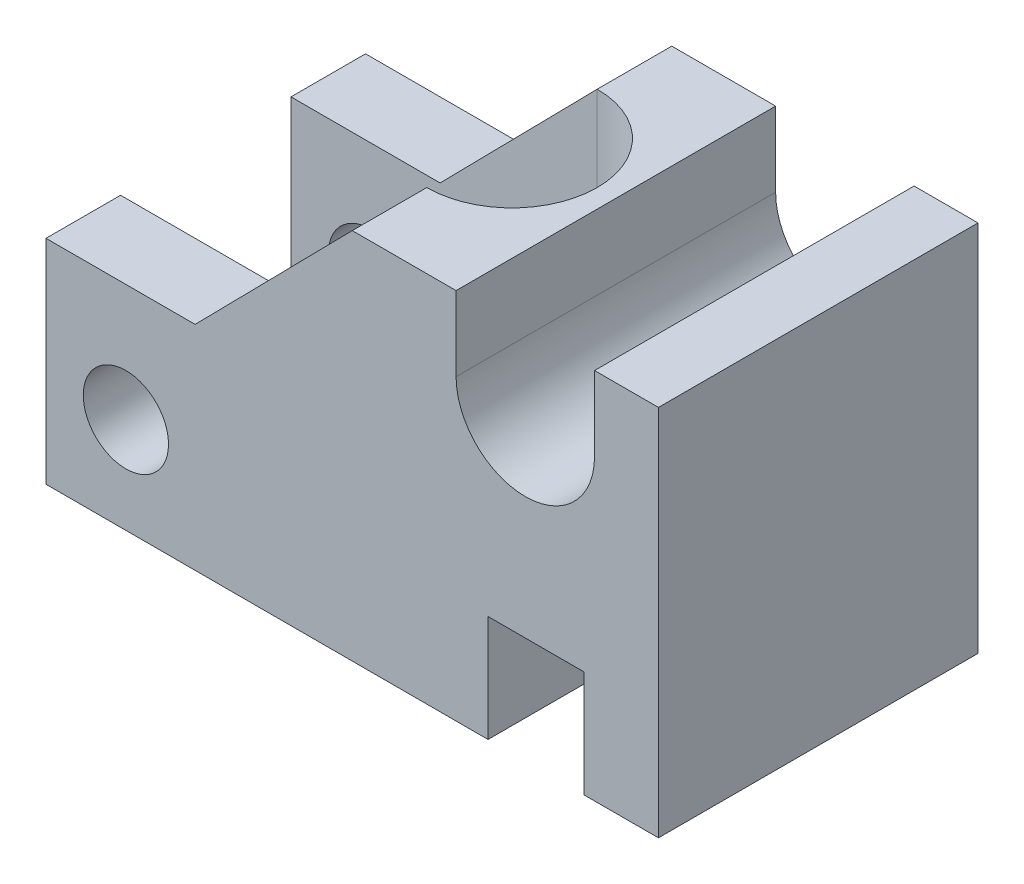
ISO-10303-21;
HEADER;
FILE_DESCRIPTION(('STEP AP214'),'2;1');
FILE_NAME('part.step','',(''),(''),'','','');
FILE_SCHEMA(('AUTOMOTIVE_DESIGN { 1 0 10303 214 1 1 1 1 }'));
ENDSEC;
DATA;
#1=APPLICATION_CONTEXT('core data for automotive mechanical design processes');
#2=APPLICATION_PROTOCOL_DEFINITION('international standard','automotive_design',2000,#1);
#3=PRODUCT_CONTEXT('',#1,'mechanical');
#4=PRODUCT('Part','Part','',(#3));
#5=PRODUCT_RELATED_PRODUCT_CATEGORY('part','',(#4));
#6=PRODUCT_DEFINITION_FORMATION('','',#4);
#7=PRODUCT_DEFINITION_CONTEXT('part definition',#1,'design');
#8=PRODUCT_DEFINITION('design','',#6,#7);
#9=PRODUCT_DEFINITION_SHAPE('','',#8);
#10=(LENGTH_UNIT() NAMED_UNIT(*) SI_UNIT(.MILLI.,.METRE.));
#11=(NAMED_UNIT(*) PLANE_ANGLE_UNIT() SI_UNIT($,.RADIAN.));
#12=(NAMED_UNIT(*) SI_UNIT($,.STERADIAN.) SOLID_ANGLE_UNIT());
#13=UNCERTAINTY_MEASURE_WITH_UNIT(LENGTH_MEASURE(1.E-05),#10,'distance_accuracy_value','');
#14=(GEOMETRIC_REPRESENTATION_CONTEXT(3) GLOBAL_UNCERTAINTY_ASSIGNED_CONTEXT((#13)) GLOBAL_UNIT_ASSIGNED_CONTEXT((#10,
#11,#12)) REPRESENTATION_CONTEXT('',''));
#15=CARTESIAN_POINT('',(0.,0.,0.));
#16=DIRECTION('',(0.,0.,1.));
#17=DIRECTION('',(1.,0.,0.));
#18=AXIS2_PLACEMENT_3D('',#15,#16,#17);
#19=CARTESIAN_POINT('',(-28.4029319771153,27.9295497774967,60.));
#20=DIRECTION('',(0.713023679810584,-0.701139951813741,0.));
#21=DIRECTION('',(0.701139951813741,0.713023679810584,0.));
#22=AXIS2_PLACEMENT_3D('',#19,#20,#21);
#23=PLANE('',#22);
#24=DIRECTION('',(0.,0.,-1.));
#25=VECTOR('',#24,1.);
#26=CARTESIAN_POINT('',(12.9663440750129,70.,60.));
#27=LINE('',#26,#25);
#28=CARTESIAN_POINT('',(12.9663440750129,70.,60.));
#29=VERTEX_POINT('',#28);
#30=CARTESIAN_POINT('',(12.966344075013,70.,46.));
#31=VERTEX_POINT('',#30);
#32=EDGE_CURVE('E290',#29,#31,#27,.T.);
#33=ORIENTED_EDGE('',*,*,#32,.T.);
#34=DIRECTION('',(-0.701139951813741,-0.713023679810584,0.));
#35=VECTOR('',#34,1.);
#36=CARTESIAN_POINT('',(-28.4029319771153,27.9295497774967,46.));
#37=LINE('',#36,#35);
#38=CARTESIAN_POINT('',(-16.5336559249871,40.,46.));
#39=VERTEX_POINT('',#38);
#40=EDGE_CURVE('E204',#31,#39,#37,.T.);
#41=ORIENTED_EDGE('',*,*,#40,.T.);
#42=DIRECTION('',(0.,0.,-1.));
#43=VECTOR('',#42,1.);
#44=CARTESIAN_POINT('',(-16.5336559249871,40.,60.));
#45=LINE('',#44,#43);
#46=CARTESIAN_POINT('',(-16.5336559249871,40.,60.));
#47=VERTEX_POINT('',#46);
#48=EDGE_CURVE('E285',#47,#39,#45,.T.);
#49=ORIENTED_EDGE('',*,*,#48,.F.);
#50=DIRECTION('',(-0.701139951813741,-0.713023679810584,0.));
#51=VECTOR('',#50,1.);
#52=CARTESIAN_POINT('',(-28.4029319771153,27.9295497774967,60.));
#53=LINE('',#52,#51);
#54=EDGE_CURVE('E349',#29,#47,#53,.T.);
#55=ORIENTED_EDGE('',*,*,#54,.F.);
#56=EDGE_LOOP('',(#33,#41,#49,#55));
#57=FACE_BOUND('',#56,.T.);
#58=ADVANCED_FACE('F47',(#57),#23,.F.);
#59=CARTESIAN_POINT('',(0.,40.,60.));
#60=DIRECTION('',(0.,-1.,0.));
#61=DIRECTION('',(1.,0.,0.));
#62=AXIS2_PLACEMENT_3D('',#59,#60,#61);
#63=PLANE('',#62);
#64=ORIENTED_EDGE('',*,*,#48,.T.);
#65=DIRECTION('',(-1.,0.,0.));
#66=VECTOR('',#65,1.);
#67=CARTESIAN_POINT('',(0.,40.,46.));
#68=LINE('',#67,#66);
#69=CARTESIAN_POINT('',(-44.5336559249871,40.,46.));
#70=VERTEX_POINT('',#69);
#71=EDGE_CURVE('E333',#39,#70,#68,.T.);
#72=ORIENTED_EDGE('',*,*,#71,.T.);
#73=DIRECTION('',(0.,0.,-1.));
#74=VECTOR('',#73,1.);
#75=CARTESIAN_POINT('',(-44.5336559249871,40.,60.));
#76=LINE('',#75,#74);
#77=CARTESIAN_POINT('',(-44.5336559249871,40.,60.));
#78=VERTEX_POINT('',#77);
#79=EDGE_CURVE('E280',#78,#70,#76,.T.);
#80=ORIENTED_EDGE('',*,*,#79,.F.);
#81=DIRECTION('',(-1.,0.,0.));
#82=VECTOR('',#81,1.);
#83=CARTESIAN_POINT('',(0.,40.,60.));
#84=LINE('',#83,#82);
#85=EDGE_CURVE('E352',#47,#78,#84,.T.);
#86=ORIENTED_EDGE('',*,*,#85,.F.);
#87=EDGE_LOOP('',(#64,#72,#80,#86));
#88=FACE_BOUND('',#87,.T.);
#89=ADVANCED_FACE('F398',(#88),#63,.F.);
#90=CARTESIAN_POINT('',(-44.5336559249871,0.,60.));
#91=DIRECTION('',(1.,0.,0.));
#92=DIRECTION('',(0.,0.,-1.));
#93=AXIS2_PLACEMENT_3D('',#90,#91,#92);
#94=PLANE('',#93);
#95=ORIENTED_EDGE('',*,*,#79,.T.);
#96=DIRECTION('',(0.,-1.,0.));
#97=VECTOR('',#96,1.);
#98=CARTESIAN_POINT('',(-44.5336559249871,0.,46.));
#99=LINE('',#98,#97);
#100=CARTESIAN_POINT('',(-44.5336559249871,-1.63899307903939E-13,46.));
#101=VERTEX_POINT('',#100);
#102=EDGE_CURVE('E329',#70,#101,#99,.T.);
#103=ORIENTED_EDGE('',*,*,#102,.T.);
#104=DIRECTION('',(0.,0.,-1.));
#105=VECTOR('',#104,1.);
#106=CARTESIAN_POINT('',(-44.5336559249871,0.,60.));
#107=LINE('',#106,#105);
#108=CARTESIAN_POINT('',(-44.5336559249871,0.,60.));
#109=VERTEX_POINT('',#108);
#110=EDGE_CURVE('E275',#109,#101,#107,.T.);
#111=ORIENTED_EDGE('',*,*,#110,.F.);
#112=DIRECTION('',(0.,-1.,0.));
#113=VECTOR('',#112,1.);
#114=CARTESIAN_POINT('',(-44.5336559249871,0.,60.));
#115=LINE('',#114,#113);
#116=EDGE_CURVE('E355',#78,#109,#115,.T.);
#117=ORIENTED_EDGE('',*,*,#116,.F.);
#118=EDGE_LOOP('',(#95,#103,#111,#117));
#119=FACE_BOUND('',#118,.T.);
#120=ADVANCED_FACE('F380',(#119),#94,.F.);
#121=CARTESIAN_POINT('',(-29.5336559249871,18.,60.));
#122=DIRECTION('',(0.,0.,-1.));
#123=DIRECTION('',(-1.,0.,0.));
#124=AXIS2_PLACEMENT_3D('',#121,#122,#123);
#125=CYLINDRICAL_SURFACE('',#124,8.);
#126=CARTESIAN_POINT('',(-29.5336559249871,18.,46.));
#127=DIRECTION('',(0.,0.,1.));
#128=DIRECTION('',(1.,0.,0.));
#129=AXIS2_PLACEMENT_3D('',#126,#127,#128);
#130=CIRCLE('',#129,8.);
#131=CARTESIAN_POINT('',(-21.5336559249871,18.,46.));
#132=VERTEX_POINT('',#131);
#133=EDGE_CURVE('E51',#132,#132,#130,.T.);
#134=ORIENTED_EDGE('',*,*,#133,.F.);
#135=EDGE_LOOP('',(#134));
#136=FACE_BOUND('',#135,.T.);
#137=CARTESIAN_POINT('',(-29.5336559249871,18.,60.));
#138=DIRECTION('',(0.,0.,1.));
#139=DIRECTION('',(1.,0.,0.));
#140=AXIS2_PLACEMENT_3D('',#137,#138,#139);
#141=CIRCLE('',#140,8.);
#142=CARTESIAN_POINT('',(-21.5336559249871,18.,60.));
#143=VERTEX_POINT('',#142);
#144=EDGE_CURVE('E192',#143,#143,#141,.T.);
#145=ORIENTED_EDGE('',*,*,#144,.T.);
#146=EDGE_LOOP('',(#145));
#147=FACE_BOUND('',#146,.T.);
#148=ADVANCED_FACE('F377',(#136,#147),#125,.F.);
#149=CARTESIAN_POINT('',(45.4663440750129,56.,60.));
#150=DIRECTION('',(0.,0.,-1.));
#151=DIRECTION('',(-1.,0.,0.));
#152=AXIS2_PLACEMENT_3D('',#149,#150,#151);
#153=CYLINDRICAL_SURFACE('',#152,13.);
#154=CARTESIAN_POINT('',(45.4663440750129,56.,0.));
#155=DIRECTION('',(0.,0.,1.));
#156=DIRECTION('',(1.,0.,0.));
#157=AXIS2_PLACEMENT_3D('',#154,#155,#156);
#158=CIRCLE('',#157,13.);
#159=CARTESIAN_POINT('',(32.4663440750129,56.,0.));
#160=VERTEX_POINT('',#159);
#161=CARTESIAN_POINT('',(58.4663440750129,56.,0.));
#162=VERTEX_POINT('',#161);
#163=EDGE_CURVE('E199',#160,#162,#158,.T.);
#164=ORIENTED_EDGE('',*,*,#163,.F.);
#165=DIRECTION('',(0.,0.,-1.));
#166=VECTOR('',#165,1.);
#167=CARTESIAN_POINT('',(32.4663440750129,56.,60.));
#168=LINE('',#167,#166);
#169=CARTESIAN_POINT('',(32.4663440750129,56.,60.));
#170=VERTEX_POINT('',#169);
#171=EDGE_CURVE('E11',#170,#160,#168,.T.);
#172=ORIENTED_EDGE('',*,*,#171,.F.);
#173=CARTESIAN_POINT('',(45.4663440750129,56.,60.));
#174=DIRECTION('',(0.,0.,1.));
#175=DIRECTION('',(1.,0.,0.));
#176=AXIS2_PLACEMENT_3D('',#173,#174,#175);
#177=CIRCLE('',#176,13.);
#178=CARTESIAN_POINT('',(58.4663440750129,56.,60.));
#179=VERTEX_POINT('',#178);
#180=EDGE_CURVE('E251',#170,#179,#177,.T.);
#181=ORIENTED_EDGE('',*,*,#180,.T.);
#182=DIRECTION('',(0.,0.,-1.));
#183=VECTOR('',#182,1.);
#184=CARTESIAN_POINT('',(58.4663440750129,56.,60.));
#185=LINE('',#184,#183);
#186=EDGE_CURVE('E124',#179,#162,#185,.T.);
#187=ORIENTED_EDGE('',*,*,#186,.T.);
#188=EDGE_LOOP('',(#164,#172,#181,#187));
#189=FACE_BOUND('',#188,.T.);
#190=ADVANCED_FACE('F49',(#189),#153,.F.);
#191=CARTESIAN_POINT('',(32.4663440750129,0.,60.));
#192=DIRECTION('',(1.,0.,0.));
#193=DIRECTION('',(0.,1.,0.));
#194=AXIS2_PLACEMENT_3D('',#191,#192,#193);
#195=PLANE('',#194);
#196=DIRECTION('',(0.,-1.,0.));
#197=VECTOR('',#196,1.);
#198=CARTESIAN_POINT('',(32.4663440750129,0.,0.));
#199=LINE('',#198,#197);
#200=CARTESIAN_POINT('',(32.4663440750129,70.,0.));
#201=VERTEX_POINT('',#200);
#202=EDGE_CURVE('E203',#201,#160,#199,.T.);
#203=ORIENTED_EDGE('',*,*,#202,.F.);
#204=DIRECTION('',(0.,0.,-1.));
#205=VECTOR('',#204,1.);
#206=CARTESIAN_POINT('',(32.4663440750129,70.,60.));
#207=LINE('',#206,#205);
#208=CARTESIAN_POINT('',(32.4663440750129,70.,60.));
#209=VERTEX_POINT('',#208);
#210=EDGE_CURVE('E57',#209,#201,#207,.T.);
#211=ORIENTED_EDGE('',*,*,#210,.F.);
#212=DIRECTION('',(0.,-1.,0.));
#213=VECTOR('',#212,1.);
#214=CARTESIAN_POINT('',(32.4663440750129,0.,60.));
#215=LINE('',#214,#213);
#216=EDGE_CURVE('E342',#209,#170,#215,.T.);
#217=ORIENTED_EDGE('',*,*,#216,.T.);
#218=ORIENTED_EDGE('',*,*,#171,.T.);
#219=EDGE_LOOP('',(#203,#211,#217,#218));
#220=FACE_BOUND('',#219,.T.);
#221=ADVANCED_FACE('F418',(#220),#195,.T.);
#222=CARTESIAN_POINT('',(0.,70.,60.));
#223=DIRECTION('',(0.,-1.,0.));
#224=DIRECTION('',(0.,0.,-1.));
#225=AXIS2_PLACEMENT_3D('',#222,#223,#224);
#226=PLANE('',#225);
#227=CARTESIAN_POINT('',(12.966344075013,70.,14.));
#228=VERTEX_POINT('',#227);
#229=CARTESIAN_POINT('',(12.9663440750129,70.,0.));
#230=VERTEX_POINT('',#229);
#231=EDGE_CURVE('E289',#228,#230,#27,.T.);
#232=ORIENTED_EDGE('',*,*,#231,.F.);
#233=CARTESIAN_POINT('',(12.966344075013,70.,30.));
#234=DIRECTION('',(0.,1.,0.));
#235=DIRECTION('',(-1.,0.,0.));
#236=AXIS2_PLACEMENT_3D('',#233,#234,#235);
#237=CIRCLE('',#236,16.);
#238=EDGE_CURVE('E319',#31,#228,#237,.T.);
#239=ORIENTED_EDGE('',*,*,#238,.F.);
#240=ORIENTED_EDGE('',*,*,#32,.F.);
#241=DIRECTION('',(-1.,0.,0.));
#242=VECTOR('',#241,1.);
#243=CARTESIAN_POINT('',(0.,70.,60.));
#244=LINE('',#243,#242);
#245=EDGE_CURVE('E346',#209,#29,#244,.T.);
#246=ORIENTED_EDGE('',*,*,#245,.F.);
#247=ORIENTED_EDGE('',*,*,#210,.T.);
#248=DIRECTION('',(-1.,0.,0.));
#249=VECTOR('',#248,1.);
#250=CARTESIAN_POINT('',(0.,70.,0.));
#251=LINE('',#250,#249);
#252=EDGE_CURVE('E208',#201,#230,#251,.T.);
#253=ORIENTED_EDGE('',*,*,#252,.T.);
#254=EDGE_LOOP('',(#232,#239,#240,#246,#247,#253));
#255=FACE_BOUND('',#254,.T.);
#256=ADVANCED_FACE('F410',(#255),#226,.F.);
#257=CARTESIAN_POINT('',(-16.5336559249871,40.,14.));
#258=VERTEX_POINT('',#257);
#259=CARTESIAN_POINT('',(-16.5336559249871,40.,0.));
#260=VERTEX_POINT('',#259);
#261=EDGE_CURVE('E284',#258,#260,#45,.T.);
#262=ORIENTED_EDGE('',*,*,#261,.F.);
#263=DIRECTION('',(0.701139951813741,0.713023679810584,0.));
#264=VECTOR('',#263,1.);
#265=CARTESIAN_POINT('',(-28.4029319771153,27.9295497774967,14.));
#266=LINE('',#265,#264);
#267=EDGE_CURVE('E325',#258,#228,#266,.T.);
#268=ORIENTED_EDGE('',*,*,#267,.T.);
#269=ORIENTED_EDGE('',*,*,#231,.T.);
#270=DIRECTION('',(-0.701139951813741,-0.713023679810584,0.));
#271=VECTOR('',#270,1.);
#272=CARTESIAN_POINT('',(-28.4029319771153,27.9295497774967,0.));
#273=LINE('',#272,#271);
#274=EDGE_CURVE('E212',#230,#260,#273,.T.);
#275=ORIENTED_EDGE('',*,*,#274,.T.);
#276=EDGE_LOOP('',(#262,#268,#269,#275));
#277=FACE_BOUND('',#276,.T.);
#278=ADVANCED_FACE('F401',(#277),#23,.F.);
#279=CARTESIAN_POINT('',(-44.5336559249871,40.,14.));
#280=VERTEX_POINT('',#279);
#281=CARTESIAN_POINT('',(-44.5336559249871,40.,0.));
#282=VERTEX_POINT('',#281);
#283=EDGE_CURVE('E279',#280,#282,#76,.T.);
#284=ORIENTED_EDGE('',*,*,#283,.F.);
#285=DIRECTION('',(1.,0.,0.));
#286=VECTOR('',#285,1.);
#287=CARTESIAN_POINT('',(0.,40.,14.));
#288=LINE('',#287,#286);
#289=EDGE_CURVE('E303',#280,#258,#288,.T.);
#290=ORIENTED_EDGE('',*,*,#289,.T.);
#291=ORIENTED_EDGE('',*,*,#261,.T.);
#292=DIRECTION('',(-1.,0.,0.));
#293=VECTOR('',#292,1.);
#294=CARTESIAN_POINT('',(0.,40.,0.));
#295=LINE('',#294,#293);
#296=EDGE_CURVE('E216',#260,#282,#295,.T.);
#297=ORIENTED_EDGE('',*,*,#296,.T.);
#298=EDGE_LOOP('',(#284,#290,#291,#297));
#299=FACE_BOUND('',#298,.T.);
#300=ADVANCED_FACE('F407',(#299),#63,.F.);
#301=CARTESIAN_POINT('',(-44.5336559249871,0.,14.));
#302=VERTEX_POINT('',#301);
#303=CARTESIAN_POINT('',(-44.5336559249871,0.,0.));
#304=VERTEX_POINT('',#303);
#305=EDGE_CURVE('E274',#302,#304,#107,.T.);
#306=ORIENTED_EDGE('',*,*,#305,.F.);
#307=DIRECTION('',(0.,1.,0.));
#308=VECTOR('',#307,1.);
#309=CARTESIAN_POINT('',(-44.5336559249871,0.,14.));
#310=LINE('',#309,#308);
#311=EDGE_CURVE('E65',#302,#280,#310,.T.);
#312=ORIENTED_EDGE('',*,*,#311,.T.);
#313=ORIENTED_EDGE('',*,*,#283,.T.);
#314=DIRECTION('',(0.,-1.,0.));
#315=VECTOR('',#314,1.);
#316=CARTESIAN_POINT('',(-44.5336559249871,0.,0.));
#317=LINE('',#316,#315);
#318=EDGE_CURVE('E220',#282,#304,#317,.T.);
#319=ORIENTED_EDGE('',*,*,#318,.T.);
#320=EDGE_LOOP('',(#306,#312,#313,#319));
#321=FACE_BOUND('',#320,.T.);
#322=ADVANCED_FACE('F416',(#321),#94,.F.);
#323=CARTESIAN_POINT('',(0.,0.,60.));
#324=DIRECTION('',(0.,1.,0.));
#325=DIRECTION('',(0.,0.,1.));
#326=AXIS2_PLACEMENT_3D('',#323,#324,#325);
#327=PLANE('',#326);
#328=ORIENTED_EDGE('',*,*,#110,.T.);
#329=DIRECTION('',(1.,0.,0.));
#330=VECTOR('',#329,1.);
#331=CARTESIAN_POINT('',(12.9663440750131,0.,46.));
#332=LINE('',#331,#330);
#333=CARTESIAN_POINT('',(12.9663440750131,0.,46.));
#334=VERTEX_POINT('',#333);
#335=EDGE_CURVE('E316',#101,#334,#332,.T.);
#336=ORIENTED_EDGE('',*,*,#335,.T.);
#337=CARTESIAN_POINT('',(12.9663440750131,0.,30.));
#338=DIRECTION('',(0.,1.,0.));
#339=DIRECTION('',(-1.,0.,0.));
#340=AXIS2_PLACEMENT_3D('',#337,#338,#339);
#341=CIRCLE('',#340,16.);
#342=CARTESIAN_POINT('',(12.9663440750131,0.,14.));
#343=VERTEX_POINT('',#342);
#344=EDGE_CURVE('E491',#334,#343,#341,.T.);
#345=ORIENTED_EDGE('',*,*,#344,.T.);
#346=DIRECTION('',(-1.,0.,0.));
#347=VECTOR('',#346,1.);
#348=CARTESIAN_POINT('',(12.9663440750131,0.,14.));
#349=LINE('',#348,#347);
#350=EDGE_CURVE('E440',#343,#302,#349,.T.);
#351=ORIENTED_EDGE('',*,*,#350,.T.);
#352=ORIENTED_EDGE('',*,*,#305,.T.);
#353=DIRECTION('',(1.,0.,0.));
#354=VECTOR('',#353,1.);
#355=CARTESIAN_POINT('',(0.,0.,0.));
#356=LINE('',#355,#354);
#357=CARTESIAN_POINT('',(38.4663440750129,0.,0.));
#358=VERTEX_POINT('',#357);
#359=EDGE_CURVE('E224',#304,#358,#356,.T.);
#360=ORIENTED_EDGE('',*,*,#359,.T.);
#361=DIRECTION('',(0.,0.,-1.));
#362=VECTOR('',#361,1.);
#363=CARTESIAN_POINT('',(38.4663440750129,0.,60.));
#364=LINE('',#363,#362);
#365=CARTESIAN_POINT('',(38.4663440750129,0.,60.));
#366=VERTEX_POINT('',#365);
#367=EDGE_CURVE('E270',#366,#358,#364,.T.);
#368=ORIENTED_EDGE('',*,*,#367,.F.);
#369=DIRECTION('',(1.,0.,0.));
#370=VECTOR('',#369,1.);
#371=CARTESIAN_POINT('',(0.,0.,60.));
#372=LINE('',#371,#370);
#373=EDGE_CURVE('E358',#109,#366,#372,.T.);
#374=ORIENTED_EDGE('',*,*,#373,.F.);
#375=EDGE_LOOP('',(#328,#336,#345,#351,#352,#360,#368,#374));
#376=FACE_BOUND('',#375,.T.);
#377=ADVANCED_FACE('F436',(#376),#327,.F.);
#378=CARTESIAN_POINT('',(38.4663440750129,0.,60.));
#379=DIRECTION('',(-1.,0.,0.));
#380=DIRECTION('',(0.,0.,1.));
#381=AXIS2_PLACEMENT_3D('',#378,#379,#380);
#382=PLANE('',#381);
#383=DIRECTION('',(0.,1.,0.));
#384=VECTOR('',#383,1.);
#385=CARTESIAN_POINT('',(38.4663440750129,0.,0.));
#386=LINE('',#385,#384);
#387=CARTESIAN_POINT('',(38.4663440750129,20.,0.));
#388=VERTEX_POINT('',#387);
#389=EDGE_CURVE('E227',#358,#388,#386,.T.);
#390=ORIENTED_EDGE('',*,*,#389,.T.);
#391=DIRECTION('',(0.,0.,-1.));
#392=VECTOR('',#391,1.);
#393=CARTESIAN_POINT('',(38.4663440750129,20.,60.));
#394=LINE('',#393,#392);
#395=CARTESIAN_POINT('',(38.4663440750129,20.,60.));
#396=VERTEX_POINT('',#395);
#397=EDGE_CURVE('E266',#396,#388,#394,.T.);
#398=ORIENTED_EDGE('',*,*,#397,.F.);
#399=DIRECTION('',(0.,1.,0.));
#400=VECTOR('',#399,1.);
#401=CARTESIAN_POINT('',(38.4663440750129,0.,60.));
#402=LINE('',#401,#400);
#403=EDGE_CURVE('E361',#366,#396,#402,.T.);
#404=ORIENTED_EDGE('',*,*,#403,.F.);
#405=ORIENTED_EDGE('',*,*,#367,.T.);
#406=EDGE_LOOP('',(#390,#398,#404,#405));
#407=FACE_BOUND('',#406,.T.);
#408=ADVANCED_FACE('F450',(#407),#382,.F.);
#409=CARTESIAN_POINT('',(0.,20.,60.));
#410=DIRECTION('',(0.,1.,0.));
#411=DIRECTION('',(0.,0.,1.));
#412=AXIS2_PLACEMENT_3D('',#409,#410,#411);
#413=PLANE('',#412);
#414=DIRECTION('',(1.,0.,0.));
#415=VECTOR('',#414,1.);
#416=CARTESIAN_POINT('',(0.,20.,0.));
#417=LINE('',#416,#415);
#418=CARTESIAN_POINT('',(56.4663440750129,20.,0.));
#419=VERTEX_POINT('',#418);
#420=EDGE_CURVE('E230',#388,#419,#417,.T.);
#421=ORIENTED_EDGE('',*,*,#420,.T.);
#422=DIRECTION('',(0.,0.,-1.));
#423=VECTOR('',#422,1.);
#424=CARTESIAN_POINT('',(56.4663440750129,20.,60.));
#425=LINE('',#424,#423);
#426=CARTESIAN_POINT('',(56.4663440750129,20.,60.));
#427=VERTEX_POINT('',#426);
#428=EDGE_CURVE('E262',#427,#419,#425,.T.);
#429=ORIENTED_EDGE('',*,*,#428,.F.);
#430=DIRECTION('',(1.,0.,0.));
#431=VECTOR('',#430,1.);
#432=CARTESIAN_POINT('',(0.,20.,60.));
#433=LINE('',#432,#431);
#434=EDGE_CURVE('E364',#396,#427,#433,.T.);
#435=ORIENTED_EDGE('',*,*,#434,.F.);
#436=ORIENTED_EDGE('',*,*,#397,.T.);
#437=EDGE_LOOP('',(#421,#429,#435,#436));
#438=FACE_BOUND('',#437,.T.);
#439=ADVANCED_FACE('F454',(#438),#413,.F.);
#440=CARTESIAN_POINT('',(56.4663440750129,0.,60.));
#441=DIRECTION('',(1.,0.,0.));
#442=DIRECTION('',(0.,0.,-1.));
#443=AXIS2_PLACEMENT_3D('',#440,#441,#442);
#444=PLANE('',#443);
#445=DIRECTION('',(0.,-1.,0.));
#446=VECTOR('',#445,1.);
#447=CARTESIAN_POINT('',(56.4663440750129,0.,0.));
#448=LINE('',#447,#446);
#449=CARTESIAN_POINT('',(56.4663440750129,0.,0.));
#450=VERTEX_POINT('',#449);
#451=EDGE_CURVE('E233',#419,#450,#448,.T.);
#452=ORIENTED_EDGE('',*,*,#451,.T.);
#453=DIRECTION('',(0.,0.,-1.));
#454=VECTOR('',#453,1.);
#455=CARTESIAN_POINT('',(56.4663440750129,0.,60.));
#456=LINE('',#455,#454);
#457=CARTESIAN_POINT('',(56.4663440750129,0.,60.));
#458=VERTEX_POINT('',#457);
#459=EDGE_CURVE('E258',#458,#450,#456,.T.);
#460=ORIENTED_EDGE('',*,*,#459,.F.);
#461=DIRECTION('',(0.,-1.,0.));
#462=VECTOR('',#461,1.);
#463=CARTESIAN_POINT('',(56.4663440750129,0.,60.));
#464=LINE('',#463,#462);
#465=EDGE_CURVE('E367',#427,#458,#464,.T.);
#466=ORIENTED_EDGE('',*,*,#465,.F.);
#467=ORIENTED_EDGE('',*,*,#428,.T.);
#468=EDGE_LOOP('',(#452,#460,#466,#467));
#469=FACE_BOUND('',#468,.T.);
#470=ADVANCED_FACE('F589',(#469),#444,.F.);
#471=CARTESIAN_POINT('',(0.,0.,60.));
#472=DIRECTION('',(0.,1.,0.));
#473=DIRECTION('',(0.,0.,1.));
#474=AXIS2_PLACEMENT_3D('',#471,#472,#473);
#475=PLANE('',#474);
#476=DIRECTION('',(1.,0.,0.));
#477=VECTOR('',#476,1.);
#478=CARTESIAN_POINT('',(0.,0.,0.));
#479=LINE('',#478,#477);
#480=CARTESIAN_POINT('',(70.4663440750129,0.,0.));
#481=VERTEX_POINT('',#480);
#482=EDGE_CURVE('E236',#450,#481,#479,.T.);
#483=ORIENTED_EDGE('',*,*,#482,.T.);
#484=DIRECTION('',(0.,0.,-1.));
#485=VECTOR('',#484,1.);
#486=CARTESIAN_POINT('',(70.4663440750129,0.,60.));
#487=LINE('',#486,#485);
#488=CARTESIAN_POINT('',(70.4663440750129,0.,60.));
#489=VERTEX_POINT('',#488);
#490=EDGE_CURVE('E184',#489,#481,#487,.T.);
#491=ORIENTED_EDGE('',*,*,#490,.F.);
#492=DIRECTION('',(1.,0.,0.));
#493=VECTOR('',#492,1.);
#494=CARTESIAN_POINT('',(0.,0.,60.));
#495=LINE('',#494,#493);
#496=EDGE_CURVE('E170',#458,#489,#495,.T.);
#497=ORIENTED_EDGE('',*,*,#496,.F.);
#498=ORIENTED_EDGE('',*,*,#459,.T.);
#499=EDGE_LOOP('',(#483,#491,#497,#498));
#500=FACE_BOUND('',#499,.T.);
#501=ADVANCED_FACE('F581',(#500),#475,.F.);
#502=CARTESIAN_POINT('',(70.4663440750129,0.,60.));
#503=DIRECTION('',(-1.,0.,0.));
#504=DIRECTION('',(0.,0.,1.));
#505=AXIS2_PLACEMENT_3D('',#502,#503,#504);
#506=PLANE('',#505);
#507=DIRECTION('',(0.,1.,0.));
#508=VECTOR('',#507,1.);
#509=CARTESIAN_POINT('',(70.4663440750129,0.,0.));
#510=LINE('',#509,#508);
#511=CARTESIAN_POINT('',(70.4663440750129,70.,0.));
#512=VERTEX_POINT('',#511);
#513=EDGE_CURVE('E180',#481,#512,#510,.T.);
#514=ORIENTED_EDGE('',*,*,#513,.T.);
#515=DIRECTION('',(0.,0.,-1.));
#516=VECTOR('',#515,1.);
#517=CARTESIAN_POINT('',(70.4663440750129,70.,60.));
#518=LINE('',#517,#516);
#519=CARTESIAN_POINT('',(70.4663440750129,70.,60.));
#520=VERTEX_POINT('',#519);
#521=EDGE_CURVE('E177',#520,#512,#518,.T.);
#522=ORIENTED_EDGE('',*,*,#521,.F.);
#523=DIRECTION('',(0.,1.,0.));
#524=VECTOR('',#523,1.);
#525=CARTESIAN_POINT('',(70.4663440750129,0.,60.));
#526=LINE('',#525,#524);
#527=EDGE_CURVE('E162',#489,#520,#526,.T.);
#528=ORIENTED_EDGE('',*,*,#527,.F.);
#529=ORIENTED_EDGE('',*,*,#490,.T.);
#530=EDGE_LOOP('',(#514,#522,#528,#529));
#531=FACE_BOUND('',#530,.T.);
#532=ADVANCED_FACE('F178',(#531),#506,.F.);
#533=CARTESIAN_POINT('',(0.,70.,60.));
#534=DIRECTION('',(0.,-1.,0.));
#535=DIRECTION('',(0.,0.,-1.));
#536=AXIS2_PLACEMENT_3D('',#533,#534,#535);
#537=PLANE('',#536);
#538=DIRECTION('',(-1.,0.,0.));
#539=VECTOR('',#538,1.);
#540=CARTESIAN_POINT('',(0.,70.,0.));
#541=LINE('',#540,#539);
#542=CARTESIAN_POINT('',(58.4663440750129,70.,0.));
#543=VERTEX_POINT('',#542);
#544=EDGE_CURVE('E241',#512,#543,#541,.T.);
#545=ORIENTED_EDGE('',*,*,#544,.T.);
#546=DIRECTION('',(0.,0.,-1.));
#547=VECTOR('',#546,1.);
#548=CARTESIAN_POINT('',(58.4663440750129,70.,60.));
#549=LINE('',#548,#547);
#550=CARTESIAN_POINT('',(58.4663440750129,70.,60.));
#551=VERTEX_POINT('',#550);
#552=EDGE_CURVE('E185',#551,#543,#549,.T.);
#553=ORIENTED_EDGE('',*,*,#552,.F.);
#554=DIRECTION('',(-1.,0.,0.));
#555=VECTOR('',#554,1.);
#556=CARTESIAN_POINT('',(0.,70.,60.));
#557=LINE('',#556,#555);
#558=EDGE_CURVE('E167',#520,#551,#557,.T.);
#559=ORIENTED_EDGE('',*,*,#558,.F.);
#560=ORIENTED_EDGE('',*,*,#521,.T.);
#561=EDGE_LOOP('',(#545,#553,#559,#560));
#562=FACE_BOUND('',#561,.T.);
#563=ADVANCED_FACE('F187',(#562),#537,.F.);
#564=CARTESIAN_POINT('',(58.4663440750129,0.,60.));
#565=DIRECTION('',(1.,0.,0.));
#566=DIRECTION('',(0.,1.,0.));
#567=AXIS2_PLACEMENT_3D('',#564,#565,#566);
#568=PLANE('',#567);
#569=DIRECTION('',(0.,-1.,0.));
#570=VECTOR('',#569,1.);
#571=CARTESIAN_POINT('',(58.4663440750129,0.,0.));
#572=LINE('',#571,#570);
#573=EDGE_CURVE('E244',#543,#162,#572,.T.);
#574=ORIENTED_EDGE('',*,*,#573,.T.);
#575=ORIENTED_EDGE('',*,*,#186,.F.);
#576=DIRECTION('',(0.,-1.,0.));
#577=VECTOR('',#576,1.);
#578=CARTESIAN_POINT('',(58.4663440750129,0.,60.));
#579=LINE('',#578,#577);
#580=EDGE_CURVE('E74',#551,#179,#579,.T.);
#581=ORIENTED_EDGE('',*,*,#580,.F.);
#582=ORIENTED_EDGE('',*,*,#552,.T.);
#583=EDGE_LOOP('',(#574,#575,#581,#582));
#584=FACE_BOUND('',#583,.T.);
#585=ADVANCED_FACE('F394',(#584),#568,.F.);
#586=CARTESIAN_POINT('',(-29.5336559249871,18.,14.));
#587=DIRECTION('',(0.,0.,-1.));
#588=DIRECTION('',(-1.,0.,0.));
#589=AXIS2_PLACEMENT_3D('',#586,#587,#588);
#590=CIRCLE('',#589,8.);
#591=CARTESIAN_POINT('',(-37.5336559249871,18.,14.));
#592=VERTEX_POINT('',#591);
#593=EDGE_CURVE('E295',#592,#592,#590,.T.);
#594=ORIENTED_EDGE('',*,*,#593,.F.);
#595=EDGE_LOOP('',(#594));
#596=FACE_BOUND('',#595,.T.);
#597=CARTESIAN_POINT('',(-29.5336559249871,18.,0.));
#598=DIRECTION('',(0.,0.,1.));
#599=DIRECTION('',(1.,0.,0.));
#600=AXIS2_PLACEMENT_3D('',#597,#598,#599);
#601=CIRCLE('',#600,8.);
#602=CARTESIAN_POINT('',(-21.5336559249871,18.,0.));
#603=VERTEX_POINT('',#602);
#604=EDGE_CURVE('E247',#603,#603,#601,.T.);
#605=ORIENTED_EDGE('',*,*,#604,.F.);
#606=EDGE_LOOP('',(#605));
#607=FACE_BOUND('',#606,.T.);
#608=ADVANCED_FACE('F382',(#596,#607),#125,.F.);
#609=CARTESIAN_POINT('',(0.,0.,60.));
#610=DIRECTION('',(0.,0.,1.));
#611=DIRECTION('',(1.,0.,0.));
#612=AXIS2_PLACEMENT_3D('',#609,#610,#611);
#613=PLANE('',#612);
#614=ORIENTED_EDGE('',*,*,#180,.F.);
#615=ORIENTED_EDGE('',*,*,#216,.F.);
#616=ORIENTED_EDGE('',*,*,#245,.T.);
#617=ORIENTED_EDGE('',*,*,#54,.T.);
#618=ORIENTED_EDGE('',*,*,#85,.T.);
#619=ORIENTED_EDGE('',*,*,#116,.T.);
#620=ORIENTED_EDGE('',*,*,#373,.T.);
#621=ORIENTED_EDGE('',*,*,#403,.T.);
#622=ORIENTED_EDGE('',*,*,#434,.T.);
#623=ORIENTED_EDGE('',*,*,#465,.T.);
#624=ORIENTED_EDGE('',*,*,#496,.T.);
#625=ORIENTED_EDGE('',*,*,#527,.T.);
#626=ORIENTED_EDGE('',*,*,#558,.T.);
#627=ORIENTED_EDGE('',*,*,#580,.T.);
#628=EDGE_LOOP('',(#614,#615,#616,#617,#618,#619,#620,#621,#622,#623,#624,#625,#626,#627));
#629=FACE_BOUND('',#628,.T.);
#630=ORIENTED_EDGE('',*,*,#144,.F.);
#631=EDGE_LOOP('',(#630));
#632=FACE_BOUND('',#631,.T.);
#633=ADVANCED_FACE('F164',(#629,#632),#613,.T.);
#634=CARTESIAN_POINT('',(0.,0.,0.));
#635=DIRECTION('',(0.,0.,1.));
#636=DIRECTION('',(1.,0.,0.));
#637=AXIS2_PLACEMENT_3D('',#634,#635,#636);
#638=PLANE('',#637);
#639=ORIENTED_EDGE('',*,*,#163,.T.);
#640=ORIENTED_EDGE('',*,*,#573,.F.);
#641=ORIENTED_EDGE('',*,*,#544,.F.);
#642=ORIENTED_EDGE('',*,*,#513,.F.);
#643=ORIENTED_EDGE('',*,*,#482,.F.);
#644=ORIENTED_EDGE('',*,*,#451,.F.);
#645=ORIENTED_EDGE('',*,*,#420,.F.);
#646=ORIENTED_EDGE('',*,*,#389,.F.);
#647=ORIENTED_EDGE('',*,*,#359,.F.);
#648=ORIENTED_EDGE('',*,*,#318,.F.);
#649=ORIENTED_EDGE('',*,*,#296,.F.);
#650=ORIENTED_EDGE('',*,*,#274,.F.);
#651=ORIENTED_EDGE('',*,*,#252,.F.);
#652=ORIENTED_EDGE('',*,*,#202,.T.);
#653=EDGE_LOOP('',(#639,#640,#641,#642,#643,#644,#645,#646,#647,#648,#649,#650,#651,#652));
#654=FACE_BOUND('',#653,.T.);
#655=ORIENTED_EDGE('',*,*,#604,.T.);
#656=EDGE_LOOP('',(#655));
#657=FACE_BOUND('',#656,.T.);
#658=ADVANCED_FACE('F385',(#654,#657),#638,.F.);
#659=CARTESIAN_POINT('',(12.9663440750131,0.,46.));
#660=DIRECTION('',(0.,0.,1.));
#661=DIRECTION('',(1.,0.,0.));
#662=AXIS2_PLACEMENT_3D('',#659,#660,#661);
#663=PLANE('',#662);
#664=ORIENTED_EDGE('',*,*,#133,.T.);
#665=EDGE_LOOP('',(#664));
#666=FACE_BOUND('',#665,.T.);
#667=DIRECTION('',(0.,1.,0.));
#668=VECTOR('',#667,1.);
#669=CARTESIAN_POINT('',(12.9663440750131,0.,46.));
#670=LINE('',#669,#668);
#671=EDGE_CURVE('E298',#334,#31,#670,.T.);
#672=ORIENTED_EDGE('',*,*,#671,.F.);
#673=ORIENTED_EDGE('',*,*,#335,.F.);
#674=ORIENTED_EDGE('',*,*,#102,.F.);
#675=ORIENTED_EDGE('',*,*,#71,.F.);
#676=ORIENTED_EDGE('',*,*,#40,.F.);
#677=EDGE_LOOP('',(#672,#673,#674,#675,#676));
#678=FACE_BOUND('',#677,.T.);
#679=ADVANCED_FACE('F374',(#666,#678),#663,.F.);
#680=CARTESIAN_POINT('',(12.9663440750131,0.,14.));
#681=DIRECTION('',(0.,0.,-1.));
#682=DIRECTION('',(-1.,0.,0.));
#683=AXIS2_PLACEMENT_3D('',#680,#681,#682);
#684=PLANE('',#683);
#685=ORIENTED_EDGE('',*,*,#593,.T.);
#686=EDGE_LOOP('',(#685));
#687=FACE_BOUND('',#686,.T.);
#688=ORIENTED_EDGE('',*,*,#289,.F.);
#689=ORIENTED_EDGE('',*,*,#311,.F.);
#690=ORIENTED_EDGE('',*,*,#350,.F.);
#691=DIRECTION('',(0.,1.,0.));
#692=VECTOR('',#691,1.);
#693=CARTESIAN_POINT('',(12.9663440750131,0.,14.));
#694=LINE('',#693,#692);
#695=EDGE_CURVE('E306',#343,#228,#694,.T.);
#696=ORIENTED_EDGE('',*,*,#695,.T.);
#697=ORIENTED_EDGE('',*,*,#267,.F.);
#698=EDGE_LOOP('',(#688,#689,#690,#696,#697));
#699=FACE_BOUND('',#698,.T.);
#700=ADVANCED_FACE('F482',(#687,#699),#684,.F.);
#701=CARTESIAN_POINT('',(12.9663440750131,0.,30.));
#702=DIRECTION('',(0.,1.,0.));
#703=DIRECTION('',(-1.,0.,0.));
#704=AXIS2_PLACEMENT_3D('',#701,#702,#703);
#705=CYLINDRICAL_SURFACE('',#704,16.);
#706=ORIENTED_EDGE('',*,*,#238,.T.);
#707=ORIENTED_EDGE('',*,*,#695,.F.);
#708=ORIENTED_EDGE('',*,*,#344,.F.);
#709=ORIENTED_EDGE('',*,*,#671,.T.);
#710=EDGE_LOOP('',(#706,#707,#708,#709));
#711=FACE_BOUND('',#710,.T.);
#712=ADVANCED_FACE('F497',(#711),#705,.F.);
#713=CLOSED_SHELL('',(#58,#89,#120,#148,#190,#221,#256,#278,#300,#322,#377,#408,#439,#470,#501,
#532,#563,#585,#608,#633,#658,#679,#700,#712));
#714=MANIFOLD_SOLID_BREP('B2',#713);
#715=ADVANCED_BREP_SHAPE_REPRESENTATION('',(#18,#714),#14);
#716=SHAPE_DEFINITION_REPRESENTATION(#9,#715);
ENDSEC;
END-ISO-10303-21;
